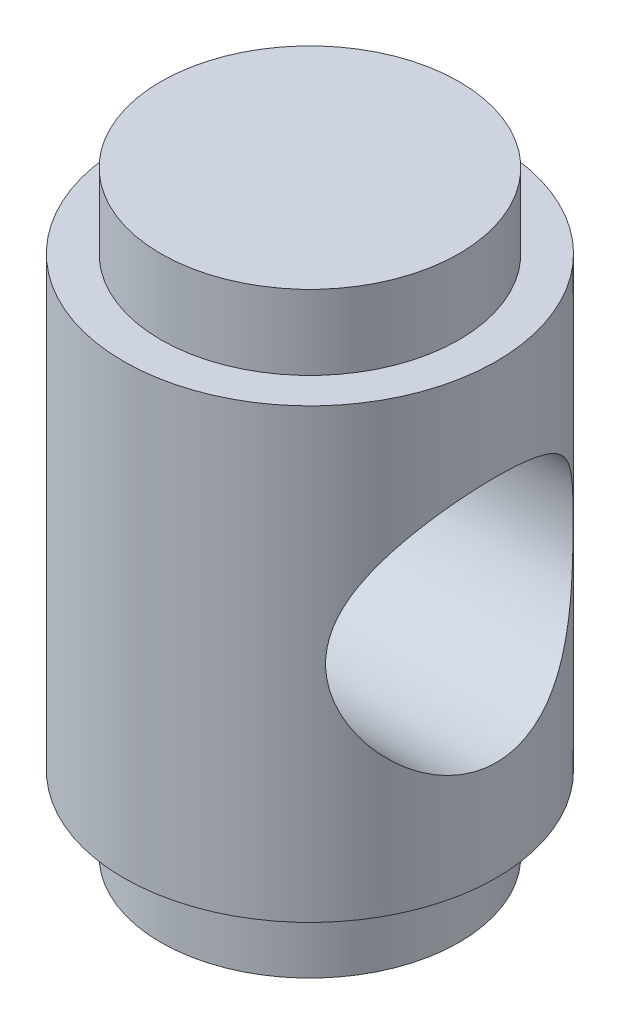
ISO-10303-21;
HEADER;
FILE_DESCRIPTION(('STEP AP214'),'2;1');
FILE_NAME('part.step','',(''),(''),'','','');
FILE_SCHEMA(('AUTOMOTIVE_DESIGN { 1 0 10303 214 1 1 1 1 }'));
ENDSEC;
DATA;
#1=APPLICATION_CONTEXT('core data for automotive mechanical design processes');
#2=APPLICATION_PROTOCOL_DEFINITION('international standard','automotive_design',2000,#1);
#3=PRODUCT_CONTEXT('',#1,'mechanical');
#4=PRODUCT('Part','Part','',(#3));
#5=PRODUCT_RELATED_PRODUCT_CATEGORY('part','',(#4));
#6=PRODUCT_DEFINITION_FORMATION('','',#4);
#7=PRODUCT_DEFINITION_CONTEXT('part definition',#1,'design');
#8=PRODUCT_DEFINITION('design','',#6,#7);
#9=PRODUCT_DEFINITION_SHAPE('','',#8);
#10=(LENGTH_UNIT() NAMED_UNIT(*) SI_UNIT(.MILLI.,.METRE.));
#11=(NAMED_UNIT(*) PLANE_ANGLE_UNIT() SI_UNIT($,.RADIAN.));
#12=(NAMED_UNIT(*) SI_UNIT($,.STERADIAN.) SOLID_ANGLE_UNIT());
#13=UNCERTAINTY_MEASURE_WITH_UNIT(LENGTH_MEASURE(1.E-05),#10,'distance_accuracy_value','');
#14=(GEOMETRIC_REPRESENTATION_CONTEXT(3) GLOBAL_UNCERTAINTY_ASSIGNED_CONTEXT((#13)) GLOBAL_UNIT_ASSIGNED_CONTEXT((#10,
#11,#12)) REPRESENTATION_CONTEXT('',''));
#15=CARTESIAN_POINT('',(0.,0.,0.));
#16=DIRECTION('',(0.,0.,1.));
#17=DIRECTION('',(1.,0.,0.));
#18=AXIS2_PLACEMENT_3D('',#15,#16,#17);
#19=CARTESIAN_POINT('',(20.,30.,0.));
#20=DIRECTION('',(0.,-1.,0.));
#21=DIRECTION('',(0.,0.,-1.));
#22=AXIS2_PLACEMENT_3D('',#19,#20,#21);
#23=PLANE('',#22);
#24=CARTESIAN_POINT('',(0.,30.,0.));
#25=DIRECTION('',(0.,1.,0.));
#26=DIRECTION('',(0.,0.,1.));
#27=AXIS2_PLACEMENT_3D('',#24,#25,#26);
#28=CIRCLE('',#27,20.);
#29=CARTESIAN_POINT('',(0.,30.,20.));
#30=VERTEX_POINT('',#29);
#31=EDGE_CURVE('E46',#30,#30,#28,.T.);
#32=ORIENTED_EDGE('',*,*,#31,.F.);
#33=EDGE_LOOP('',(#32));
#34=FACE_BOUND('',#33,.T.);
#35=CARTESIAN_POINT('',(0.,30.,0.));
#36=DIRECTION('',(0.,1.,0.));
#37=DIRECTION('',(0.,0.,1.));
#38=AXIS2_PLACEMENT_3D('',#35,#36,#37);
#39=CIRCLE('',#38,25.);
#40=CARTESIAN_POINT('',(0.,30.,25.));
#41=VERTEX_POINT('',#40);
#42=EDGE_CURVE('E82',#41,#41,#39,.T.);
#43=ORIENTED_EDGE('',*,*,#42,.T.);
#44=EDGE_LOOP('',(#43));
#45=FACE_BOUND('',#44,.T.);
#46=ADVANCED_FACE('F31',(#34,#45),#23,.F.);
#47=CARTESIAN_POINT('',(0.,40.,0.));
#48=DIRECTION('',(0.,1.,0.));
#49=DIRECTION('',(0.,0.,1.));
#50=AXIS2_PLACEMENT_3D('',#47,#48,#49);
#51=CYLINDRICAL_SURFACE('',#50,20.);
#52=CARTESIAN_POINT('',(0.,40.,0.));
#53=DIRECTION('',(0.,1.,0.));
#54=DIRECTION('',(0.,0.,1.));
#55=AXIS2_PLACEMENT_3D('',#52,#53,#54);
#56=CIRCLE('',#55,20.);
#57=CARTESIAN_POINT('',(0.,40.,20.));
#58=VERTEX_POINT('',#57);
#59=EDGE_CURVE('E50',#58,#58,#56,.T.);
#60=ORIENTED_EDGE('',*,*,#59,.F.);
#61=EDGE_LOOP('',(#60));
#62=FACE_BOUND('',#61,.T.);
#63=ORIENTED_EDGE('',*,*,#31,.T.);
#64=EDGE_LOOP('',(#63));
#65=FACE_BOUND('',#64,.T.);
#66=ADVANCED_FACE('F71',(#62,#65),#51,.T.);
#67=CARTESIAN_POINT('',(0.,40.,0.));
#68=DIRECTION('',(0.,-1.,0.));
#69=DIRECTION('',(0.,0.,-1.));
#70=AXIS2_PLACEMENT_3D('',#67,#68,#69);
#71=PLANE('',#70);
#72=ORIENTED_EDGE('',*,*,#59,.T.);
#73=EDGE_LOOP('',(#72));
#74=FACE_BOUND('',#73,.T.);
#75=ADVANCED_FACE('F76',(#74),#71,.F.);
#76=CARTESIAN_POINT('',(0.,-40.,0.));
#77=DIRECTION('',(0.,1.,0.));
#78=DIRECTION('',(0.,0.,1.));
#79=AXIS2_PLACEMENT_3D('',#76,#77,#78);
#80=PLANE('',#79);
#81=CARTESIAN_POINT('',(0.,-40.,0.));
#82=DIRECTION('',(0.,1.,0.));
#83=DIRECTION('',(0.,0.,1.));
#84=AXIS2_PLACEMENT_3D('',#81,#82,#83);
#85=CIRCLE('',#84,20.);
#86=CARTESIAN_POINT('',(0.,-40.,20.));
#87=VERTEX_POINT('',#86);
#88=EDGE_CURVE('E92',#87,#87,#85,.T.);
#89=ORIENTED_EDGE('',*,*,#88,.F.);
#90=EDGE_LOOP('',(#89));
#91=FACE_BOUND('',#90,.T.);
#92=ADVANCED_FACE('F99',(#91),#80,.F.);
#93=CARTESIAN_POINT('',(0.,40.,0.));
#94=DIRECTION('',(0.,1.,0.));
#95=DIRECTION('',(0.,0.,1.));
#96=AXIS2_PLACEMENT_3D('',#93,#94,#95);
#97=CYLINDRICAL_SURFACE('',#96,20.);
#98=CARTESIAN_POINT('',(0.,-30.,0.));
#99=DIRECTION('',(0.,1.,0.));
#100=DIRECTION('',(0.,0.,1.));
#101=AXIS2_PLACEMENT_3D('',#98,#99,#100);
#102=CIRCLE('',#101,20.);
#103=CARTESIAN_POINT('',(0.,-30.,20.));
#104=VERTEX_POINT('',#103);
#105=EDGE_CURVE('E87',#104,#104,#102,.T.);
#106=ORIENTED_EDGE('',*,*,#105,.F.);
#107=EDGE_LOOP('',(#106));
#108=FACE_BOUND('',#107,.T.);
#109=ORIENTED_EDGE('',*,*,#88,.T.);
#110=EDGE_LOOP('',(#109));
#111=FACE_BOUND('',#110,.T.);
#112=ADVANCED_FACE('F104',(#108,#111),#97,.T.);
#113=CARTESIAN_POINT('',(25.,-30.,0.));
#114=DIRECTION('',(0.,1.,0.));
#115=DIRECTION('',(0.,0.,1.));
#116=AXIS2_PLACEMENT_3D('',#113,#114,#115);
#117=PLANE('',#116);
#118=CARTESIAN_POINT('',(0.,-30.,0.));
#119=DIRECTION('',(0.,1.,0.));
#120=DIRECTION('',(0.,0.,1.));
#121=AXIS2_PLACEMENT_3D('',#118,#119,#120);
#122=CIRCLE('',#121,25.);
#123=CARTESIAN_POINT('',(0.,-30.,25.));
#124=VERTEX_POINT('',#123);
#125=EDGE_CURVE('E84',#124,#124,#122,.T.);
#126=ORIENTED_EDGE('',*,*,#125,.F.);
#127=EDGE_LOOP('',(#126));
#128=FACE_BOUND('',#127,.T.);
#129=ORIENTED_EDGE('',*,*,#105,.T.);
#130=EDGE_LOOP('',(#129));
#131=FACE_BOUND('',#130,.T.);
#132=ADVANCED_FACE('F68',(#128,#131),#117,.F.);
#133=CARTESIAN_POINT('',(0.,40.,0.));
#134=DIRECTION('',(0.,1.,0.));
#135=DIRECTION('',(0.,0.,1.));
#136=AXIS2_PLACEMENT_3D('',#133,#134,#135);
#137=CYLINDRICAL_SURFACE('',#136,25.);
#138=CARTESIAN_POINT('',(-25.,16.6,0.));
#139=CARTESIAN_POINT('',(-24.9999993457709,16.5999992814072,0.417342193262426));
#140=CARTESIAN_POINT('',(-24.9895269424681,16.5842399265756,0.834693871088642));
#141=CARTESIAN_POINT('',(-24.947899523746,16.5214478335093,1.66599362096309));
#142=CARTESIAN_POINT('',(-24.9167439557146,16.4744142596911,2.07994160177231));
#143=CARTESIAN_POINT('',(-24.8345030766869,16.349762518527,2.9013653507679));
#144=CARTESIAN_POINT('',(-24.7834090586409,16.2721309890147,3.30883821027504));
#145=CARTESIAN_POINT('',(-24.6625080892567,16.0873919153252,4.11418525755774));
#146=CARTESIAN_POINT('',(-24.5927010093656,15.9802841686553,4.51205937937242));
#147=CARTESIAN_POINT('',(-24.4363252281247,15.7385653381786,5.29378528575928));
#148=CARTESIAN_POINT('',(-24.3498382323737,15.6040881513075,5.67769500049307));
#149=CARTESIAN_POINT('',(-24.1617060120331,15.30885290866,6.43139559389211));
#150=CARTESIAN_POINT('',(-24.060060847972,15.1480949578254,6.80118652892785));
#151=CARTESIAN_POINT('',(-23.8436077034578,14.8018876913959,7.52496226687935));
#152=CARTESIAN_POINT('',(-23.7288003143234,14.616439484961,7.87894777886858));
#153=CARTESIAN_POINT('',(-23.4881104183748,14.2223652603677,8.56986193095836));
#154=CARTESIAN_POINT('',(-23.3622264500659,14.0137361826619,8.90678831093138));
#155=CARTESIAN_POINT('',(-23.0905538128181,13.5561934440279,9.59024096579045));
#156=CARTESIAN_POINT('',(-22.9439819978317,13.3053655537902,9.93517414341239));
#157=CARTESIAN_POINT('',(-22.6432325647148,12.7797668317729,10.6027388087575));
#158=CARTESIAN_POINT('',(-22.4890546022295,12.5049949155377,10.9253692851746));
#159=CARTESIAN_POINT('',(-22.1758205426182,11.9324982422782,11.5479243871805));
#160=CARTESIAN_POINT('',(-22.0167582061338,11.6347433238205,11.8478181158099));
#161=CARTESIAN_POINT('',(-21.6970240678592,11.017734701745,12.4236721413768));
#162=CARTESIAN_POINT('',(-21.5363521938723,10.6984800300355,12.6996313593082));
#163=CARTESIAN_POINT('',(-21.1916178746245,9.98778292085862,13.2680963589192));
#164=CARTESIAN_POINT('',(-21.0078285206597,9.59286081695882,13.556436709954));
#165=CARTESIAN_POINT('',(-20.6478685977652,8.77660031845535,14.0986333068893));
#166=CARTESIAN_POINT('',(-20.4716997449691,8.35525602538218,14.3524818125159));
#167=CARTESIAN_POINT('',(-20.1332728260117,7.48784336002543,14.8234706606882));
#168=CARTESIAN_POINT('',(-19.9709960051876,7.04180970362269,15.0406608908195));
#169=CARTESIAN_POINT('',(-19.7429438115142,6.35534204198148,15.3372667006814));
#170=CARTESIAN_POINT('',(-19.6694965347518,6.12365176812038,15.4312604388682));
#171=CARTESIAN_POINT('',(-19.5285539647457,5.65459780324084,15.6092427309782));
#172=CARTESIAN_POINT('',(-19.4610601503842,5.41723272106779,15.6932288007334));
#173=CARTESIAN_POINT('',(-19.3056677724379,4.83502808784375,15.8843374518817));
#174=CARTESIAN_POINT('',(-19.2213129568413,4.48744897658682,15.9860908319384));
#175=CARTESIAN_POINT('',(-19.0691706138678,3.78304871502497,16.1672739678767));
#176=CARTESIAN_POINT('',(-19.0013785622908,3.4262301180502,16.246709820791));
#177=CARTESIAN_POINT('',(-18.8847588741321,2.70560568200974,16.3821208368519));
#178=CARTESIAN_POINT('',(-18.8359046143191,2.34181041208923,16.4381289441516));
#179=CARTESIAN_POINT('',(-18.7589056736049,1.6091085358444,16.5259460385796));
#180=CARTESIAN_POINT('',(-18.7307611187667,1.24020189842041,16.5577548784038));
#181=CARTESIAN_POINT('',(-18.6962785390489,0.498561894489705,16.5966822693072));
#182=CARTESIAN_POINT('',(-18.6900288249084,0.125819098674037,16.6037008321145));
#183=CARTESIAN_POINT('',(-18.699852460766,-0.618994999260119,16.5926359768036));
#184=CARTESIAN_POINT('',(-18.7159258921211,-0.991066298926384,16.5745524672007));
#185=CARTESIAN_POINT('',(-18.7697283321081,-1.7318499218197,16.5135983930768));
#186=CARTESIAN_POINT('',(-18.8074734004089,-2.10055954782272,16.4707094464257));
#187=CARTESIAN_POINT('',(-18.9030974365968,-2.83169681404681,16.3608736281492));
#188=CARTESIAN_POINT('',(-18.9609767930567,-3.19412433288742,16.2939262922187));
#189=CARTESIAN_POINT('',(-19.0918459264557,-3.89513103355639,16.1403565982358));
#190=CARTESIAN_POINT('',(-19.1640791834194,-4.23406565536623,16.0547037389985));
#191=CARTESIAN_POINT('',(-19.322837453416,-4.90282398382929,15.8632731363841));
#192=CARTESIAN_POINT('',(-19.409368001366,-5.23264410403441,15.7574875966153));
#193=CARTESIAN_POINT('',(-19.6869450984195,-6.20668592391697,15.4114062913073));
#194=CARTESIAN_POINT('',(-19.8960517156422,-6.83586501913001,15.1423019651082));
#195=CARTESIAN_POINT('',(-20.2547530789824,-7.8057559238701,14.6559415785972));
#196=CARTESIAN_POINT('',(-20.3948686586541,-8.16153065109978,14.4607402119221));
#197=CARTESIAN_POINT('',(-20.6824953073092,-8.85580845852026,14.0462794429015));
#198=CARTESIAN_POINT('',(-20.8300070806373,-9.19430988754586,13.8270177469022));
#199=CARTESIAN_POINT('',(-21.1293001890319,-9.85361563595448,13.3651968296204));
#200=CARTESIAN_POINT('',(-21.2810860386949,-10.1744000949743,13.1226122662163));
#201=CARTESIAN_POINT('',(-21.5857953942263,-10.7972360781552,12.6151125015523));
#202=CARTESIAN_POINT('',(-21.7387189744562,-11.0992863655971,12.3501958287763));
#203=CARTESIAN_POINT('',(-22.0752146840881,-11.7459234018486,11.7401271690573));
#204=CARTESIAN_POINT('',(-22.2584018523377,-12.0859288827476,11.3898805946381));
#205=CARTESIAN_POINT('',(-22.6176587370241,-12.73544928216,10.6586836673411));
#206=CARTESIAN_POINT('',(-22.7937271513114,-13.0449586371228,10.277727734975));
#207=CARTESIAN_POINT('',(-23.1341324977518,-13.6310285420584,9.48667735007178));
#208=CARTESIAN_POINT('',(-23.2984781557869,-13.9076137040641,9.07660503387831));
#209=CARTESIAN_POINT('',(-23.5329541687473,-14.2958218894996,8.44103792637577));
#210=CARTESIAN_POINT('',(-23.6091011915629,-14.4207724191525,8.2257871426811));
#211=CARTESIAN_POINT('',(-23.7569051593829,-14.6614998036467,7.78862643889858));
#212=CARTESIAN_POINT('',(-23.8285609458853,-14.7772742935745,7.56671482232005));
#213=CARTESIAN_POINT('',(-24.0087782733268,-15.0665494778542,6.98008211096137));
#214=CARTESIAN_POINT('',(-24.113372076094,-15.2324858557558,6.6103579822452));
#215=CARTESIAN_POINT('',(-24.3074878080902,-15.5379491740529,5.85641096884909));
#216=CARTESIAN_POINT('',(-24.3970125510937,-15.6774810454431,5.47219080738358));
#217=CARTESIAN_POINT('',(-24.5590923779496,-15.9285343596186,4.69145963650133));
#218=CARTESIAN_POINT('',(-24.631658245681,-16.040073605821,4.29495662024559));
#219=CARTESIAN_POINT('',(-24.7582656373306,-16.2338257738562,3.49191815917419));
#220=CARTESIAN_POINT('',(-24.8123068698064,-16.3160382343007,3.08538255662684));
#221=CARTESIAN_POINT('',(-24.9007726821171,-16.4502596741413,2.26342332503728));
#222=CARTESIAN_POINT('',(-24.9351125151766,-16.5021381882566,1.84796915689266));
#223=CARTESIAN_POINT('',(-24.9829618146807,-16.5743511176099,1.01312420036314));
#224=CARTESIAN_POINT('',(-24.9964712564318,-16.5946854954538,0.593733407312139));
#225=CARTESIAN_POINT('',(-25.0023161843827,-16.6034883331005,-0.245517311154931));
#226=CARTESIAN_POINT('',(-24.9946522895266,-16.5919577243885,-0.665377222498983));
#227=CARTESIAN_POINT('',(-24.9583462804266,-16.5372147091264,-1.50209454696001));
#228=CARTESIAN_POINT('',(-24.9297050218539,-16.494003594831,-1.91895208184422));
#229=CARTESIAN_POINT('',(-24.8548311059118,-16.3806074151648,-2.71793973991638));
#230=CARTESIAN_POINT('',(-24.8099398798018,-16.3124759240815,-3.10049057737623));
#231=CARTESIAN_POINT('',(-24.7035371456296,-16.1501858144117,-3.85764084224933));
#232=CARTESIAN_POINT('',(-24.6420265507116,-16.0560286257895,-4.23224070530621));
#233=CARTESIAN_POINT('',(-24.5036112820618,-15.8427757089794,-4.97136087407744));
#234=CARTESIAN_POINT('',(-24.4267056135859,-15.7236783692744,-5.33588052673145));
#235=CARTESIAN_POINT('',(-24.2589546332973,-15.4617912227409,-6.05299502479188));
#236=CARTESIAN_POINT('',(-24.168108576023,-15.3190001488578,-6.40558923125428));
#237=CARTESIAN_POINT('',(-23.9680665594296,-15.001478285951,-7.11880131262942));
#238=CARTESIAN_POINT('',(-23.8580818054843,-14.8253154947008,-7.4785597044944));
#239=CARTESIAN_POINT('',(-23.6262679377683,-14.4493061175349,-8.18146997180044));
#240=CARTESIAN_POINT('',(-23.5044384552079,-14.2494587941507,-8.52462132967724));
#241=CARTESIAN_POINT('',(-23.2510226487076,-13.8274559765725,-9.19335984768617));
#242=CARTESIAN_POINT('',(-23.1194318107743,-13.6052901444809,-9.51893875995477));
#243=CARTESIAN_POINT('',(-22.8487426696338,-13.140047113844,-10.1515196725624));
#244=CARTESIAN_POINT('',(-22.7096435379757,-12.8969676059591,-10.4585196149739));
#245=CARTESIAN_POINT('',(-22.4038318905385,-12.3511366868161,-11.1001683466786));
#246=CARTESIAN_POINT('',(-22.2362256348179,-12.0450218984487,-11.4315357084937));
#247=CARTESIAN_POINT('',(-21.8976140011543,-11.4078201684746,-12.0674897818467));
#248=CARTESIAN_POINT('',(-21.7266081706888,-11.0767298857287,-12.3720728984309));
#249=CARTESIAN_POINT('',(-21.3849415333808,-10.39058755129,-12.9536903111541));
#250=CARTESIAN_POINT('',(-21.2142810184769,-10.0355202546451,-13.230706797834));
#251=CARTESIAN_POINT('',(-20.8775667592535,-9.30261950433703,-13.7558889613021));
#252=CARTESIAN_POINT('',(-20.7115125187846,-8.92478851660374,-14.0040577545826));
#253=CARTESIAN_POINT('',(-20.4031853142886,-8.18250269549151,-14.449101628863));
#254=CARTESIAN_POINT('',(-20.2601213232822,-7.81994192134373,-14.6485873837104));
#255=CARTESIAN_POINT('',(-19.985274050418,-7.07743532352415,-15.0213999978919));
#256=CARTESIAN_POINT('',(-19.8534908632272,-6.69748935399887,-15.1947266377111));
#257=CARTESIAN_POINT('',(-19.6054398990754,-5.92182985516541,-15.5134609205829));
#258=CARTESIAN_POINT('',(-19.4891494099295,-5.52614053656154,-15.6589095730143));
#259=CARTESIAN_POINT('',(-19.2760996924824,-4.72005573499241,-15.9204422572025));
#260=CARTESIAN_POINT('',(-19.1793361335977,-4.30966353658327,-16.0365328013009));
#261=CARTESIAN_POINT('',(-19.0243389652486,-3.54946313692117,-16.2199354093432));
#262=CARTESIAN_POINT('',(-18.9623258489865,-3.20162366486953,-16.2922286959105));
#263=CARTESIAN_POINT('',(-18.8564642967335,-2.49933135118656,-16.4146377378783));
#264=CARTESIAN_POINT('',(-18.8126137055093,-2.14487929944816,-16.4647561246835));
#265=CARTESIAN_POINT('',(-18.7447199990854,-1.43189510558567,-16.5420111355604));
#266=CARTESIAN_POINT('',(-18.7206595073269,-1.07336682364611,-16.5691679214931));
#267=CARTESIAN_POINT('',(-18.6932255172714,-0.354496113086118,-16.6001131595567));
#268=CARTESIAN_POINT('',(-18.6898523453144,0.00584634406296372,-16.6039012430492));
#269=CARTESIAN_POINT('',(-18.7039331487183,0.725722924310845,-16.5880376340801));
#270=CARTESIAN_POINT('',(-18.7213941592999,1.08525673326515,-16.5683780238766));
#271=CARTESIAN_POINT('',(-18.7764580505868,1.80073015196379,-16.5059485709049));
#272=CARTESIAN_POINT('',(-18.814060764933,2.15666979136919,-16.4631789190126));
#273=CARTESIAN_POINT('',(-18.9080401628321,2.86298145419075,-16.3551559191806));
#274=CARTESIAN_POINT('',(-18.9644372276901,3.21334699878798,-16.2898781599211));
#275=CARTESIAN_POINT('',(-19.0940474441413,3.90622149239006,-16.137760430139));
#276=CARTESIAN_POINT('',(-19.1672643143618,4.24872868557673,-16.0509156911097));
#277=CARTESIAN_POINT('',(-19.3500941023344,5.01597842413287,-15.83033693631));
#278=CARTESIAN_POINT('',(-19.4641928419034,5.43784053683941,-15.6902739134139));
#279=CARTESIAN_POINT('',(-19.7110454184608,6.26426580571449,-15.3790148975918));
#280=CARTESIAN_POINT('',(-19.8438044326962,6.66882412021898,-15.2078102606117));
#281=CARTESIAN_POINT('',(-20.1233481625596,7.45963251079883,-14.8359364007847));
#282=CARTESIAN_POINT('',(-20.2701477801772,7.84586246901179,-14.6352357484086));
#283=CARTESIAN_POINT('',(-20.5732093714699,8.59858411333245,-14.2060571595043));
#284=CARTESIAN_POINT('',(-20.7294708328062,8.96507686614108,-13.9775807263016));
#285=CARTESIAN_POINT('',(-21.0502494296434,9.68391928355111,-13.4897635419534));
#286=CARTESIAN_POINT('',(-21.2148639342365,10.0359018075201,-13.2299464036439));
#287=CARTESIAN_POINT('',(-21.5458216488915,10.7178022362644,-12.6838292468398));
#288=CARTESIAN_POINT('',(-21.7121648568306,11.0477201681313,-12.3975292608625));
#289=CARTESIAN_POINT('',(-22.0430296802741,11.6845707190351,-11.7992257080364));
#290=CARTESIAN_POINT('',(-22.2075507607517,11.9914967319038,-11.4872148074493));
#291=CARTESIAN_POINT('',(-22.5313311244068,12.5809991187453,-10.8383859162224));
#292=CARTESIAN_POINT('',(-22.6905899943093,12.8635735830247,-10.5015659838473));
#293=CARTESIAN_POINT('',(-23.0217906622091,13.4397087643115,-9.75629559801678));
#294=CARTESIAN_POINT('',(-23.1924884417259,13.7294871667641,-9.344348511434));
#295=CARTESIAN_POINT('',(-23.5182205219252,14.2728400915218,-8.49128066546493));
#296=CARTESIAN_POINT('',(-23.6732525201724,14.526409294335,-8.05015563344802));
#297=CARTESIAN_POINT('',(-23.9629705987705,14.993918499305,-7.14162661988945));
#298=CARTESIAN_POINT('',(-24.0976838447245,15.2079115019328,-6.67425889290921));
#299=CARTESIAN_POINT('',(-24.2814298798015,15.4968807972738,-5.95595135361637));
#300=CARTESIAN_POINT('',(-24.3396206508329,15.5878611771785,-5.71365965290767));
#301=CARTESIAN_POINT('',(-24.4494613507287,15.758821622741,-5.22368360030104));
#302=CARTESIAN_POINT('',(-24.5011095927479,15.8387988519373,-4.97599787688714));
#303=CARTESIAN_POINT('',(-24.6221657187008,16.0255549830604,-4.34714154074432));
#304=CARTESIAN_POINT('',(-24.6870376598521,16.1249502644203,-3.96286290874712));
#305=CARTESIAN_POINT('',(-24.7992887527278,16.2962850885457,-3.18580816963634));
#306=CARTESIAN_POINT('',(-24.8466711888517,16.3682297864128,-2.79303367266424));
#307=CARTESIAN_POINT('',(-24.9228989911112,16.4837125591178,-2.00174309137106));
#308=CARTESIAN_POINT('',(-24.9517542271775,16.5272657590486,-1.60323017994303));
#309=CARTESIAN_POINT('',(-24.9903056476368,16.5854107340922,-0.803147899707809));
#310=CARTESIAN_POINT('',(-25.0000006295176,16.6000006914501,-0.401578340650711));
#311=CARTESIAN_POINT('',(-25.,16.6,0.));
#312=B_SPLINE_CURVE_WITH_KNOTS('',3,(#138,#139,#140,#141,#142,#143,#144,#145,#146,#147,#148,
#149,#150,#151,#152,#153,#154,#155,#156,#157,#158,#159,#160,#161,#162,#163,#164,#165,#166,#167,
#168,#169,#170,#171,#172,#173,#174,#175,#176,#177,#178,#179,#180,#181,#182,#183,#184,#185,#186,
#187,#188,#189,#190,#191,#192,#193,#194,#195,#196,#197,#198,#199,#200,#201,#202,#203,#204,#205,
#206,#207,#208,#209,#210,#211,#212,#213,#214,#215,#216,#217,#218,#219,#220,#221,#222,#223,#224,
#225,#226,#227,#228,#229,#230,#231,#232,#233,#234,#235,#236,#237,#238,#239,#240,#241,#242,#243,
#244,#245,#246,#247,#248,#249,#250,#251,#252,#253,#254,#255,#256,#257,#258,#259,#260,#261,#262,
#263,#264,#265,#266,#267,#268,#269,#270,#271,#272,#273,#274,#275,#276,#277,#278,#279,#280,#281,
#282,#283,#284,#285,#286,#287,#288,#289,#290,#291,#292,#293,#294,#295,#296,#297,#298,#299,#300,
#301,#302,#303,#304,#305,#306,#307,#308,#309,#310,#311),.UNSPECIFIED.,.T.,.F.,(4,2,2,2,2,2,2,2,
2,2,2,2,2,2,2,2,2,2,2,2,2,2,2,2,2,2,2,2,2,2,2,2,2,2,2,2,2,2,2,2,2,2,2,2,2,2,2,2,2,2,2,2,2,2,2,2,
2,2,2,2,2,2,2,2,2,2,2,2,2,2,2,2,2,2,2,2,2,2,2,2,2,2,2,2,2,2,4),(0.,1.25161819333795,
2.50326982871015,3.75546866864644,5.00767611102871,6.25389871541757,7.50011634362954,
8.74627800690057,9.99260434171914,11.3442070644248,12.6958710348056,14.0493400299518,
15.4028700099606,16.9681519300126,18.533784535016,20.0972690126914,20.8787827879067,
21.6604901531665,22.7749447692217,23.8890946253309,25.0016724509819,26.1142570489914,
27.231324016241,28.3483950546629,29.4662949639253,30.5842164488004,31.6540810580949,
32.7243608191912,34.8637536805653,36.1508372293995,37.4380435817498,38.7266647412138,
40.0153708774743,41.5776386910972,43.1401909908598,44.7015677914178,45.4821544798912,
46.2629416968639,47.5171678766134,48.7711596001985,50.0243517474713,51.2775636099202,
52.5361265834248,53.7946910488968,55.0532187240917,56.3116950665265,57.4838471430016,
58.655934829167,59.8280982735891,61.0003244212595,62.245280396609,63.4902751465117,
64.735849258513,65.9815610868303,67.4238437061433,68.8663196126092,70.3097214635766,
71.7529672348313,73.065335379053,74.3777145354349,75.6881480703495,76.9982906637941,
78.0791162289723,79.1598135025744,80.2395608614513,81.3193252531697,82.3994543595207,
83.479574544754,84.5608698856455,85.6424045165063,87.0171619839344,88.3923016300911,
89.7689173276393,91.1454585509208,92.5464654450247,93.9474706189024,95.3488768056888,
96.7503927935148,98.3435741928878,99.9369894061991,101.528255015451,102.323760144702,
103.119469961551,104.324605295762,105.529514199213,106.733780682008,107.938122743087),.UNSPECIFIED.);
#313=CARTESIAN_POINT('',(-25.,16.6,0.));
#314=VERTEX_POINT('',#313);
#315=EDGE_CURVE('E10',#314,#314,#312,.T.);
#316=ORIENTED_EDGE('',*,*,#315,.T.);
#317=EDGE_LOOP('',(#316));
#318=FACE_BOUND('',#317,.T.);
#319=CARTESIAN_POINT('',(25.,16.6,0.));
#320=CARTESIAN_POINT('',(24.9999993457709,16.5999992814072,-0.417342193262426));
#321=CARTESIAN_POINT('',(24.9895269424681,16.5842399265756,-0.834693871088642));
#322=CARTESIAN_POINT('',(24.947899523746,16.5214478335093,-1.66599362096309));
#323=CARTESIAN_POINT('',(24.9167439557146,16.4744142596911,-2.07994160177231));
#324=CARTESIAN_POINT('',(24.8345030766869,16.349762518527,-2.9013653507679));
#325=CARTESIAN_POINT('',(24.7834090586409,16.2721309890147,-3.30883821027504));
#326=CARTESIAN_POINT('',(24.6625080892567,16.0873919153252,-4.11418525755774));
#327=CARTESIAN_POINT('',(24.5927010093656,15.9802841686553,-4.51205937937242));
#328=CARTESIAN_POINT('',(24.4363252281247,15.7385653381786,-5.29378528575928));
#329=CARTESIAN_POINT('',(24.3498382323737,15.6040881513075,-5.67769500049307));
#330=CARTESIAN_POINT('',(24.1617060120331,15.30885290866,-6.43139559389211));
#331=CARTESIAN_POINT('',(24.060060847972,15.1480949578254,-6.80118652892785));
#332=CARTESIAN_POINT('',(23.8436077034578,14.8018876913959,-7.52496226687935));
#333=CARTESIAN_POINT('',(23.7288003143234,14.616439484961,-7.87894777886858));
#334=CARTESIAN_POINT('',(23.4881104183748,14.2223652603677,-8.56986193095836));
#335=CARTESIAN_POINT('',(23.3622264500659,14.0137361826619,-8.90678831093138));
#336=CARTESIAN_POINT('',(23.0905538128181,13.5561934440279,-9.59024096579045));
#337=CARTESIAN_POINT('',(22.9439819978317,13.3053655537902,-9.93517414341239));
#338=CARTESIAN_POINT('',(22.6432325647148,12.7797668317729,-10.6027388087575));
#339=CARTESIAN_POINT('',(22.4890546022295,12.5049949155377,-10.9253692851746));
#340=CARTESIAN_POINT('',(22.1758205426182,11.9324982422782,-11.5479243871805));
#341=CARTESIAN_POINT('',(22.0167582061338,11.6347433238205,-11.8478181158099));
#342=CARTESIAN_POINT('',(21.6970240678592,11.017734701745,-12.4236721413768));
#343=CARTESIAN_POINT('',(21.5363521938723,10.6984800300355,-12.6996313593082));
#344=CARTESIAN_POINT('',(21.1916178746245,9.98778292085862,-13.2680963589192));
#345=CARTESIAN_POINT('',(21.0078285206597,9.59286081695882,-13.556436709954));
#346=CARTESIAN_POINT('',(20.6478685977652,8.77660031845535,-14.0986333068893));
#347=CARTESIAN_POINT('',(20.4716997449691,8.35525602538218,-14.3524818125159));
#348=CARTESIAN_POINT('',(20.1332728260117,7.48784336002543,-14.8234706606882));
#349=CARTESIAN_POINT('',(19.9709960051876,7.04180970362269,-15.0406608908195));
#350=CARTESIAN_POINT('',(19.7429438115142,6.35534204198148,-15.3372667006814));
#351=CARTESIAN_POINT('',(19.6694965347518,6.12365176812038,-15.4312604388682));
#352=CARTESIAN_POINT('',(19.5285539647457,5.65459780324084,-15.6092427309782));
#353=CARTESIAN_POINT('',(19.4610601503842,5.41723272106779,-15.6932288007334));
#354=CARTESIAN_POINT('',(19.3056677724379,4.83502808784375,-15.8843374518817));
#355=CARTESIAN_POINT('',(19.2213129568413,4.48744897658682,-15.9860908319384));
#356=CARTESIAN_POINT('',(19.0691706138678,3.78304871502497,-16.1672739678767));
#357=CARTESIAN_POINT('',(19.0013785622908,3.4262301180502,-16.246709820791));
#358=CARTESIAN_POINT('',(18.8847588741321,2.70560568200974,-16.3821208368519));
#359=CARTESIAN_POINT('',(18.8359046143191,2.34181041208923,-16.4381289441516));
#360=CARTESIAN_POINT('',(18.7589056736049,1.6091085358444,-16.5259460385796));
#361=CARTESIAN_POINT('',(18.7307611187667,1.24020189842041,-16.5577548784038));
#362=CARTESIAN_POINT('',(18.6962785390489,0.498561894489705,-16.5966822693072));
#363=CARTESIAN_POINT('',(18.6900288249084,0.125819098674037,-16.6037008321145));
#364=CARTESIAN_POINT('',(18.699852460766,-0.618994999260119,-16.5926359768036));
#365=CARTESIAN_POINT('',(18.7159258921211,-0.991066298926384,-16.5745524672007));
#366=CARTESIAN_POINT('',(18.7697283321081,-1.7318499218197,-16.5135983930768));
#367=CARTESIAN_POINT('',(18.8074734004089,-2.10055954782272,-16.4707094464257));
#368=CARTESIAN_POINT('',(18.9030974365968,-2.83169681404681,-16.3608736281492));
#369=CARTESIAN_POINT('',(18.9609767930567,-3.19412433288742,-16.2939262922187));
#370=CARTESIAN_POINT('',(19.0918459264557,-3.89513103355639,-16.1403565982358));
#371=CARTESIAN_POINT('',(19.1640791834194,-4.23406565536623,-16.0547037389985));
#372=CARTESIAN_POINT('',(19.322837453416,-4.90282398382929,-15.8632731363841));
#373=CARTESIAN_POINT('',(19.409368001366,-5.23264410403441,-15.7574875966153));
#374=CARTESIAN_POINT('',(19.6869450984195,-6.20668592391697,-15.4114062913073));
#375=CARTESIAN_POINT('',(19.8960517156422,-6.83586501913001,-15.1423019651082));
#376=CARTESIAN_POINT('',(20.2547530789824,-7.8057559238701,-14.6559415785972));
#377=CARTESIAN_POINT('',(20.3948686586541,-8.16153065109978,-14.4607402119221));
#378=CARTESIAN_POINT('',(20.6824953073092,-8.85580845852026,-14.0462794429015));
#379=CARTESIAN_POINT('',(20.8300070806373,-9.19430988754586,-13.8270177469022));
#380=CARTESIAN_POINT('',(21.1293001890319,-9.85361563595448,-13.3651968296204));
#381=CARTESIAN_POINT('',(21.2810860386949,-10.1744000949743,-13.1226122662163));
#382=CARTESIAN_POINT('',(21.5857953942263,-10.7972360781552,-12.6151125015523));
#383=CARTESIAN_POINT('',(21.7387189744562,-11.0992863655971,-12.3501958287763));
#384=CARTESIAN_POINT('',(22.0752146840881,-11.7459234018486,-11.7401271690573));
#385=CARTESIAN_POINT('',(22.2584018523377,-12.0859288827476,-11.3898805946381));
#386=CARTESIAN_POINT('',(22.6176587370241,-12.73544928216,-10.6586836673411));
#387=CARTESIAN_POINT('',(22.7937271513114,-13.0449586371228,-10.277727734975));
#388=CARTESIAN_POINT('',(23.1341324977518,-13.6310285420584,-9.48667735007178));
#389=CARTESIAN_POINT('',(23.2984781557869,-13.9076137040641,-9.07660503387831));
#390=CARTESIAN_POINT('',(23.5329541687473,-14.2958218894996,-8.44103792637577));
#391=CARTESIAN_POINT('',(23.6091011915629,-14.4207724191525,-8.2257871426811));
#392=CARTESIAN_POINT('',(23.7569051593829,-14.6614998036467,-7.78862643889858));
#393=CARTESIAN_POINT('',(23.8285609458853,-14.7772742935745,-7.56671482232005));
#394=CARTESIAN_POINT('',(24.0087782733268,-15.0665494778542,-6.98008211096137));
#395=CARTESIAN_POINT('',(24.113372076094,-15.2324858557558,-6.6103579822452));
#396=CARTESIAN_POINT('',(24.3074878080902,-15.5379491740529,-5.85641096884909));
#397=CARTESIAN_POINT('',(24.3970125510937,-15.6774810454431,-5.47219080738358));
#398=CARTESIAN_POINT('',(24.5590923779496,-15.9285343596186,-4.69145963650133));
#399=CARTESIAN_POINT('',(24.631658245681,-16.040073605821,-4.29495662024559));
#400=CARTESIAN_POINT('',(24.7582656373306,-16.2338257738562,-3.49191815917419));
#401=CARTESIAN_POINT('',(24.8123068698064,-16.3160382343007,-3.08538255662684));
#402=CARTESIAN_POINT('',(24.9007726821171,-16.4502596741413,-2.26342332503728));
#403=CARTESIAN_POINT('',(24.9351125151766,-16.5021381882566,-1.84796915689266));
#404=CARTESIAN_POINT('',(24.9829618146807,-16.5743511176099,-1.01312420036314));
#405=CARTESIAN_POINT('',(24.9964712564318,-16.5946854954538,-0.593733407312139));
#406=CARTESIAN_POINT('',(25.0023161843827,-16.6034883331005,0.245517311154931));
#407=CARTESIAN_POINT('',(24.9946522895266,-16.5919577243885,0.665377222498983));
#408=CARTESIAN_POINT('',(24.9583462804266,-16.5372147091264,1.50209454696001));
#409=CARTESIAN_POINT('',(24.9297050218539,-16.494003594831,1.91895208184422));
#410=CARTESIAN_POINT('',(24.8548311059118,-16.3806074151648,2.71793973991638));
#411=CARTESIAN_POINT('',(24.8099398798018,-16.3124759240815,3.10049057737623));
#412=CARTESIAN_POINT('',(24.7035371456296,-16.1501858144117,3.85764084224933));
#413=CARTESIAN_POINT('',(24.6420265507116,-16.0560286257895,4.23224070530621));
#414=CARTESIAN_POINT('',(24.5036112820618,-15.8427757089794,4.97136087407744));
#415=CARTESIAN_POINT('',(24.4267056135859,-15.7236783692744,5.33588052673145));
#416=CARTESIAN_POINT('',(24.2589546332973,-15.4617912227409,6.05299502479188));
#417=CARTESIAN_POINT('',(24.168108576023,-15.3190001488578,6.40558923125428));
#418=CARTESIAN_POINT('',(23.9680665594296,-15.001478285951,7.11880131262942));
#419=CARTESIAN_POINT('',(23.8580818054843,-14.8253154947008,7.4785597044944));
#420=CARTESIAN_POINT('',(23.6262679377683,-14.4493061175349,8.18146997180044));
#421=CARTESIAN_POINT('',(23.5044384552079,-14.2494587941507,8.52462132967724));
#422=CARTESIAN_POINT('',(23.2510226487076,-13.8274559765725,9.19335984768617));
#423=CARTESIAN_POINT('',(23.1194318107743,-13.6052901444809,9.51893875995477));
#424=CARTESIAN_POINT('',(22.8487426696338,-13.140047113844,10.1515196725624));
#425=CARTESIAN_POINT('',(22.7096435379757,-12.8969676059591,10.4585196149739));
#426=CARTESIAN_POINT('',(22.4038318905385,-12.3511366868161,11.1001683466786));
#427=CARTESIAN_POINT('',(22.2362256348179,-12.0450218984487,11.4315357084937));
#428=CARTESIAN_POINT('',(21.8976140011543,-11.4078201684746,12.0674897818467));
#429=CARTESIAN_POINT('',(21.7266081706888,-11.0767298857287,12.3720728984309));
#430=CARTESIAN_POINT('',(21.3849415333808,-10.39058755129,12.9536903111541));
#431=CARTESIAN_POINT('',(21.2142810184769,-10.0355202546451,13.230706797834));
#432=CARTESIAN_POINT('',(20.8775667592535,-9.30261950433703,13.7558889613021));
#433=CARTESIAN_POINT('',(20.7115125187846,-8.92478851660374,14.0040577545826));
#434=CARTESIAN_POINT('',(20.4031853142886,-8.18250269549151,14.449101628863));
#435=CARTESIAN_POINT('',(20.2601213232822,-7.81994192134373,14.6485873837104));
#436=CARTESIAN_POINT('',(19.985274050418,-7.07743532352415,15.0213999978919));
#437=CARTESIAN_POINT('',(19.8534908632272,-6.69748935399887,15.1947266377111));
#438=CARTESIAN_POINT('',(19.6054398990754,-5.92182985516541,15.5134609205829));
#439=CARTESIAN_POINT('',(19.4891494099295,-5.52614053656154,15.6589095730143));
#440=CARTESIAN_POINT('',(19.2760996924824,-4.72005573499241,15.9204422572025));
#441=CARTESIAN_POINT('',(19.1793361335977,-4.30966353658327,16.0365328013009));
#442=CARTESIAN_POINT('',(19.0243389652486,-3.54946313692117,16.2199354093432));
#443=CARTESIAN_POINT('',(18.9623258489865,-3.20162366486953,16.2922286959105));
#444=CARTESIAN_POINT('',(18.8564642967335,-2.49933135118656,16.4146377378783));
#445=CARTESIAN_POINT('',(18.8126137055093,-2.14487929944816,16.4647561246835));
#446=CARTESIAN_POINT('',(18.7447199990854,-1.43189510558567,16.5420111355604));
#447=CARTESIAN_POINT('',(18.7206595073269,-1.07336682364611,16.5691679214931));
#448=CARTESIAN_POINT('',(18.6932255172714,-0.354496113086118,16.6001131595567));
#449=CARTESIAN_POINT('',(18.6898523453144,0.00584634406296372,16.6039012430492));
#450=CARTESIAN_POINT('',(18.7039331487183,0.725722924310845,16.5880376340801));
#451=CARTESIAN_POINT('',(18.7213941592999,1.08525673326515,16.5683780238766));
#452=CARTESIAN_POINT('',(18.7764580505868,1.80073015196379,16.5059485709049));
#453=CARTESIAN_POINT('',(18.814060764933,2.15666979136919,16.4631789190126));
#454=CARTESIAN_POINT('',(18.9080401628321,2.86298145419075,16.3551559191806));
#455=CARTESIAN_POINT('',(18.9644372276901,3.21334699878798,16.2898781599211));
#456=CARTESIAN_POINT('',(19.0940474441413,3.90622149239006,16.137760430139));
#457=CARTESIAN_POINT('',(19.1672643143618,4.24872868557673,16.0509156911097));
#458=CARTESIAN_POINT('',(19.3500941023344,5.01597842413287,15.83033693631));
#459=CARTESIAN_POINT('',(19.4641928419034,5.43784053683941,15.6902739134139));
#460=CARTESIAN_POINT('',(19.7110454184608,6.26426580571449,15.3790148975918));
#461=CARTESIAN_POINT('',(19.8438044326962,6.66882412021898,15.2078102606117));
#462=CARTESIAN_POINT('',(20.1233481625596,7.45963251079883,14.8359364007847));
#463=CARTESIAN_POINT('',(20.2701477801772,7.84586246901179,14.6352357484086));
#464=CARTESIAN_POINT('',(20.5732093714699,8.59858411333245,14.2060571595043));
#465=CARTESIAN_POINT('',(20.7294708328062,8.96507686614108,13.9775807263016));
#466=CARTESIAN_POINT('',(21.0502494296434,9.68391928355111,13.4897635419534));
#467=CARTESIAN_POINT('',(21.2148639342365,10.0359018075201,13.2299464036439));
#468=CARTESIAN_POINT('',(21.5458216488915,10.7178022362644,12.6838292468398));
#469=CARTESIAN_POINT('',(21.7121648568306,11.0477201681313,12.3975292608625));
#470=CARTESIAN_POINT('',(22.0430296802741,11.6845707190351,11.7992257080364));
#471=CARTESIAN_POINT('',(22.2075507607517,11.9914967319038,11.4872148074493));
#472=CARTESIAN_POINT('',(22.5313311244068,12.5809991187453,10.8383859162224));
#473=CARTESIAN_POINT('',(22.6905899943093,12.8635735830247,10.5015659838473));
#474=CARTESIAN_POINT('',(23.0217906622091,13.4397087643115,9.75629559801678));
#475=CARTESIAN_POINT('',(23.1924884417259,13.7294871667641,9.344348511434));
#476=CARTESIAN_POINT('',(23.5182205219252,14.2728400915218,8.49128066546493));
#477=CARTESIAN_POINT('',(23.6732525201724,14.526409294335,8.05015563344802));
#478=CARTESIAN_POINT('',(23.9629705987705,14.993918499305,7.14162661988945));
#479=CARTESIAN_POINT('',(24.0976838447245,15.2079115019328,6.67425889290921));
#480=CARTESIAN_POINT('',(24.2814298798015,15.4968807972738,5.95595135361637));
#481=CARTESIAN_POINT('',(24.3396206508329,15.5878611771785,5.71365965290767));
#482=CARTESIAN_POINT('',(24.4494613507287,15.758821622741,5.22368360030104));
#483=CARTESIAN_POINT('',(24.5011095927479,15.8387988519373,4.97599787688714));
#484=CARTESIAN_POINT('',(24.6221657187008,16.0255549830604,4.34714154074432));
#485=CARTESIAN_POINT('',(24.6870376598521,16.1249502644203,3.96286290874712));
#486=CARTESIAN_POINT('',(24.7992887527278,16.2962850885457,3.18580816963634));
#487=CARTESIAN_POINT('',(24.8466711888517,16.3682297864128,2.79303367266424));
#488=CARTESIAN_POINT('',(24.9228989911112,16.4837125591178,2.00174309137106));
#489=CARTESIAN_POINT('',(24.9517542271775,16.5272657590486,1.60323017994303));
#490=CARTESIAN_POINT('',(24.9903056476368,16.5854107340922,0.803147899707809));
#491=CARTESIAN_POINT('',(25.0000006295176,16.6000006914501,0.401578340650711));
#492=CARTESIAN_POINT('',(25.,16.6,0.));
#493=B_SPLINE_CURVE_WITH_KNOTS('',3,(#319,#320,#321,#322,#323,#324,#325,#326,#327,#328,#329,
#330,#331,#332,#333,#334,#335,#336,#337,#338,#339,#340,#341,#342,#343,#344,#345,#346,#347,#348,
#349,#350,#351,#352,#353,#354,#355,#356,#357,#358,#359,#360,#361,#362,#363,#364,#365,#366,#367,
#368,#369,#370,#371,#372,#373,#374,#375,#376,#377,#378,#379,#380,#381,#382,#383,#384,#385,#386,
#387,#388,#389,#390,#391,#392,#393,#394,#395,#396,#397,#398,#399,#400,#401,#402,#403,#404,#405,
#406,#407,#408,#409,#410,#411,#412,#413,#414,#415,#416,#417,#418,#419,#420,#421,#422,#423,#424,
#425,#426,#427,#428,#429,#430,#431,#432,#433,#434,#435,#436,#437,#438,#439,#440,#441,#442,#443,
#444,#445,#446,#447,#448,#449,#450,#451,#452,#453,#454,#455,#456,#457,#458,#459,#460,#461,#462,
#463,#464,#465,#466,#467,#468,#469,#470,#471,#472,#473,#474,#475,#476,#477,#478,#479,#480,#481,
#482,#483,#484,#485,#486,#487,#488,#489,#490,#491,#492),.UNSPECIFIED.,.T.,.F.,(4,2,2,2,2,2,2,2,
2,2,2,2,2,2,2,2,2,2,2,2,2,2,2,2,2,2,2,2,2,2,2,2,2,2,2,2,2,2,2,2,2,2,2,2,2,2,2,2,2,2,2,2,2,2,2,2,
2,2,2,2,2,2,2,2,2,2,2,2,2,2,2,2,2,2,2,2,2,2,2,2,2,2,2,2,2,2,4),(0.,1.25161819333795,
2.50326982871015,3.75546866864644,5.00767611102871,6.25389871541757,7.50011634362954,
8.74627800690057,9.99260434171914,11.3442070644248,12.6958710348056,14.0493400299518,
15.4028700099606,16.9681519300126,18.533784535016,20.0972690126914,20.8787827879067,
21.6604901531665,22.7749447692217,23.8890946253309,25.0016724509819,26.1142570489914,
27.231324016241,28.3483950546629,29.4662949639253,30.5842164488004,31.6540810580949,
32.7243608191912,34.8637536805653,36.1508372293995,37.4380435817498,38.7266647412138,
40.0153708774743,41.5776386910972,43.1401909908598,44.7015677914178,45.4821544798912,
46.2629416968639,47.5171678766134,48.7711596001985,50.0243517474713,51.2775636099202,
52.5361265834248,53.7946910488968,55.0532187240917,56.3116950665265,57.4838471430016,
58.655934829167,59.8280982735891,61.0003244212595,62.245280396609,63.4902751465117,
64.735849258513,65.9815610868303,67.4238437061433,68.8663196126092,70.3097214635766,
71.7529672348313,73.065335379053,74.3777145354349,75.6881480703495,76.9982906637941,
78.0791162289723,79.1598135025744,80.2395608614513,81.3193252531697,82.3994543595207,
83.479574544754,84.5608698856455,85.6424045165063,87.0171619839344,88.3923016300911,
89.7689173276393,91.1454585509208,92.5464654450247,93.9474706189024,95.3488768056888,
96.7503927935148,98.3435741928878,99.9369894061991,101.528255015451,102.323760144702,
103.119469961551,104.324605295762,105.529514199213,106.733780682008,107.938122743087),.UNSPECIFIED.);
#494=CARTESIAN_POINT('',(25.,16.6,0.));
#495=VERTEX_POINT('',#494);
#496=EDGE_CURVE('E42',#495,#495,#493,.T.);
#497=ORIENTED_EDGE('',*,*,#496,.T.);
#498=EDGE_LOOP('',(#497));
#499=FACE_BOUND('',#498,.T.);
#500=ORIENTED_EDGE('',*,*,#42,.F.);
#501=EDGE_LOOP('',(#500));
#502=FACE_BOUND('',#501,.T.);
#503=ORIENTED_EDGE('',*,*,#125,.T.);
#504=EDGE_LOOP('',(#503));
#505=FACE_BOUND('',#504,.T.);
#506=ADVANCED_FACE('F57',(#318,#499,#502,#505),#137,.T.);
#507=CARTESIAN_POINT('',(0.,0.,0.));
#508=DIRECTION('',(-1.,0.,0.));
#509=DIRECTION('',(0.,0.,1.));
#510=AXIS2_PLACEMENT_3D('',#507,#508,#509);
#511=CYLINDRICAL_SURFACE('',#510,16.6);
#512=ORIENTED_EDGE('',*,*,#496,.F.);
#513=EDGE_LOOP('',(#512));
#514=FACE_BOUND('',#513,.T.);
#515=ORIENTED_EDGE('',*,*,#315,.F.);
#516=EDGE_LOOP('',(#515));
#517=FACE_BOUND('',#516,.T.);
#518=ADVANCED_FACE('F60',(#514,#517),#511,.F.);
#519=CLOSED_SHELL('',(#46,#66,#75,#92,#112,#132,#506,#518));
#520=MANIFOLD_SOLID_BREP('B2',#519);
#521=ADVANCED_BREP_SHAPE_REPRESENTATION('',(#18,#520),#14);
#522=SHAPE_DEFINITION_REPRESENTATION(#9,#521);
ENDSEC;
END-ISO-10303-21;
